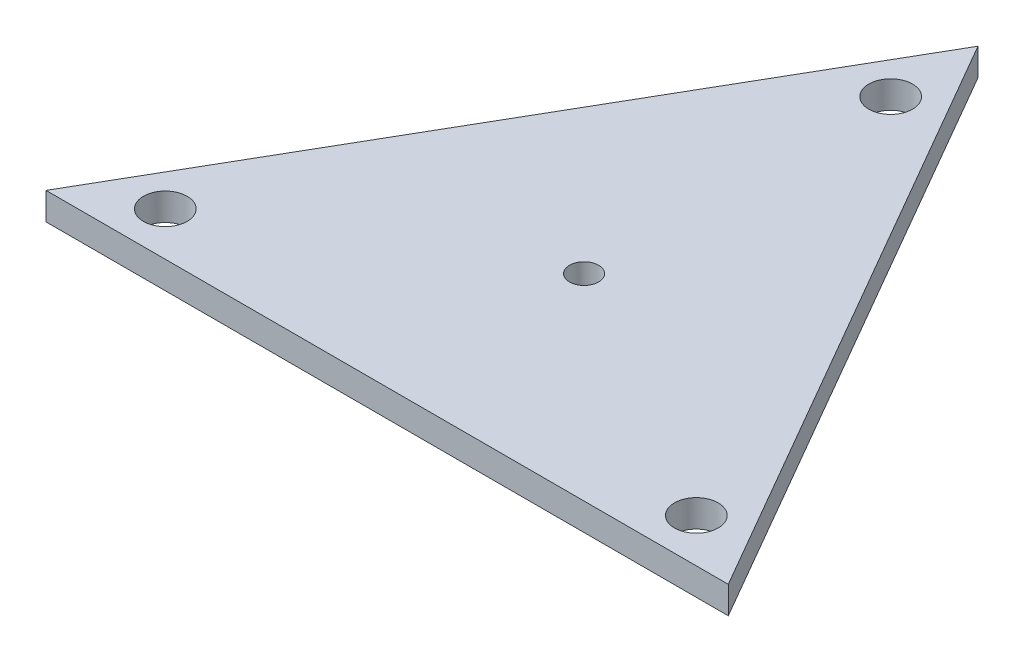
ISO-10303-21;
HEADER;
FILE_DESCRIPTION(('STEP AP214'),'2;1');
FILE_NAME('part.step','',(''),(''),'','','');
FILE_SCHEMA(('AUTOMOTIVE_DESIGN { 1 0 10303 214 1 1 1 1 }'));
ENDSEC;
DATA;
#1=APPLICATION_CONTEXT('core data for automotive mechanical design processes');
#2=APPLICATION_PROTOCOL_DEFINITION('international standard','automotive_design',2000,#1);
#3=PRODUCT_CONTEXT('',#1,'mechanical');
#4=PRODUCT('Part','Part','',(#3));
#5=PRODUCT_RELATED_PRODUCT_CATEGORY('part','',(#4));
#6=PRODUCT_DEFINITION_FORMATION('','',#4);
#7=PRODUCT_DEFINITION_CONTEXT('part definition',#1,'design');
#8=PRODUCT_DEFINITION('design','',#6,#7);
#9=PRODUCT_DEFINITION_SHAPE('','',#8);
#10=(LENGTH_UNIT() NAMED_UNIT(*) SI_UNIT(.MILLI.,.METRE.));
#11=(NAMED_UNIT(*) PLANE_ANGLE_UNIT() SI_UNIT($,.RADIAN.));
#12=(NAMED_UNIT(*) SI_UNIT($,.STERADIAN.) SOLID_ANGLE_UNIT());
#13=UNCERTAINTY_MEASURE_WITH_UNIT(LENGTH_MEASURE(1.E-05),#10,'distance_accuracy_value','');
#14=(GEOMETRIC_REPRESENTATION_CONTEXT(3) GLOBAL_UNCERTAINTY_ASSIGNED_CONTEXT((#13)) GLOBAL_UNIT_ASSIGNED_CONTEXT((#10,
#11,#12)) REPRESENTATION_CONTEXT('',''));
#15=CARTESIAN_POINT('',(0.,0.,0.));
#16=DIRECTION('',(0.,0.,1.));
#17=DIRECTION('',(1.,0.,0.));
#18=AXIS2_PLACEMENT_3D('',#15,#16,#17);
#19=CARTESIAN_POINT('',(-62.5,5.,0.));
#20=DIRECTION('',(0.866025403784439,0.,0.5));
#21=DIRECTION('',(0.5,0.,-0.866025403784439));
#22=AXIS2_PLACEMENT_3D('',#19,#20,#21);
#23=PLANE('',#22);
#24=DIRECTION('',(-0.5,0.,0.866025403784439));
#25=VECTOR('',#24,1.);
#26=CARTESIAN_POINT('',(-62.5,0.,0.));
#27=LINE('',#26,#25);
#28=CARTESIAN_POINT('',(0.,0.,-108.253175473055));
#29=VERTEX_POINT('',#28);
#30=CARTESIAN_POINT('',(-62.5,0.,0.));
#31=VERTEX_POINT('',#30);
#32=EDGE_CURVE('E95',#29,#31,#27,.T.);
#33=ORIENTED_EDGE('',*,*,#32,.T.);
#34=DIRECTION('',(0.,-1.,0.));
#35=VECTOR('',#34,1.);
#36=CARTESIAN_POINT('',(-62.5,5.,0.));
#37=LINE('',#36,#35);
#38=CARTESIAN_POINT('',(-62.5,5.,0.));
#39=VERTEX_POINT('',#38);
#40=EDGE_CURVE('E11',#39,#31,#37,.T.);
#41=ORIENTED_EDGE('',*,*,#40,.F.);
#42=DIRECTION('',(-0.5,0.,0.866025403784439));
#43=VECTOR('',#42,1.);
#44=CARTESIAN_POINT('',(-62.5,5.,0.));
#45=LINE('',#44,#43);
#46=CARTESIAN_POINT('',(0.,5.,-108.253175473055));
#47=VERTEX_POINT('',#46);
#48=EDGE_CURVE('E87',#47,#39,#45,.T.);
#49=ORIENTED_EDGE('',*,*,#48,.F.);
#50=DIRECTION('',(0.,-1.,0.));
#51=VECTOR('',#50,1.);
#52=CARTESIAN_POINT('',(0.,5.,-108.253175473055));
#53=LINE('',#52,#51);
#54=EDGE_CURVE('E96',#47,#29,#53,.T.);
#55=ORIENTED_EDGE('',*,*,#54,.T.);
#56=EDGE_LOOP('',(#33,#41,#49,#55));
#57=FACE_BOUND('',#56,.T.);
#58=ADVANCED_FACE('F45',(#57),#23,.F.);
#59=CARTESIAN_POINT('',(62.5,5.,0.));
#60=DIRECTION('',(0.,0.,-1.));
#61=DIRECTION('',(-1.,0.,0.));
#62=AXIS2_PLACEMENT_3D('',#59,#60,#61);
#63=PLANE('',#62);
#64=DIRECTION('',(1.,0.,0.));
#65=VECTOR('',#64,1.);
#66=CARTESIAN_POINT('',(62.5,0.,0.));
#67=LINE('',#66,#65);
#68=CARTESIAN_POINT('',(62.5,0.,0.));
#69=VERTEX_POINT('',#68);
#70=EDGE_CURVE('E74',#31,#69,#67,.T.);
#71=ORIENTED_EDGE('',*,*,#70,.T.);
#72=DIRECTION('',(0.,-1.,0.));
#73=VECTOR('',#72,1.);
#74=CARTESIAN_POINT('',(62.5,5.,0.));
#75=LINE('',#74,#73);
#76=CARTESIAN_POINT('',(62.5,5.,0.));
#77=VERTEX_POINT('',#76);
#78=EDGE_CURVE('E54',#77,#69,#75,.T.);
#79=ORIENTED_EDGE('',*,*,#78,.F.);
#80=DIRECTION('',(1.,0.,0.));
#81=VECTOR('',#80,1.);
#82=CARTESIAN_POINT('',(62.5,5.,0.));
#83=LINE('',#82,#81);
#84=EDGE_CURVE('E82',#39,#77,#83,.T.);
#85=ORIENTED_EDGE('',*,*,#84,.F.);
#86=ORIENTED_EDGE('',*,*,#40,.T.);
#87=EDGE_LOOP('',(#71,#79,#85,#86));
#88=FACE_BOUND('',#87,.T.);
#89=ADVANCED_FACE('F83',(#88),#63,.F.);
#90=CARTESIAN_POINT('',(0.,5.,-108.253175473055));
#91=DIRECTION('',(-0.866025403784439,0.,0.5));
#92=DIRECTION('',(0.5,0.,0.866025403784439));
#93=AXIS2_PLACEMENT_3D('',#90,#91,#92);
#94=PLANE('',#93);
#95=DIRECTION('',(-0.5,0.,-0.866025403784439));
#96=VECTOR('',#95,1.);
#97=CARTESIAN_POINT('',(0.,0.,-108.253175473055));
#98=LINE('',#97,#96);
#99=EDGE_CURVE('E79',#69,#29,#98,.T.);
#100=ORIENTED_EDGE('',*,*,#99,.T.);
#101=ORIENTED_EDGE('',*,*,#54,.F.);
#102=DIRECTION('',(-0.5,0.,-0.866025403784439));
#103=VECTOR('',#102,1.);
#104=CARTESIAN_POINT('',(0.,5.,-108.253175473055));
#105=LINE('',#104,#103);
#106=EDGE_CURVE('E62',#77,#47,#105,.T.);
#107=ORIENTED_EDGE('',*,*,#106,.F.);
#108=ORIENTED_EDGE('',*,*,#78,.T.);
#109=EDGE_LOOP('',(#100,#101,#107,#108));
#110=FACE_BOUND('',#109,.T.);
#111=ADVANCED_FACE('F113',(#110),#94,.F.);
#112=CARTESIAN_POINT('',(0.,5.,0.));
#113=DIRECTION('',(0.,-1.,0.));
#114=DIRECTION('',(0.,0.,-1.));
#115=AXIS2_PLACEMENT_3D('',#112,#113,#114);
#116=PLANE('',#115);
#117=CARTESIAN_POINT('',(-48.643593539449,5.,-8.));
#118=DIRECTION('',(0.,-1.,0.));
#119=DIRECTION('',(0.,0.,-1.));
#120=AXIS2_PLACEMENT_3D('',#117,#118,#119);
#121=CIRCLE('',#120,4.00000000000001);
#122=CARTESIAN_POINT('',(-48.643593539449,5.,-12.));
#123=VERTEX_POINT('',#122);
#124=EDGE_CURVE('E99',#123,#123,#121,.T.);
#125=ORIENTED_EDGE('',*,*,#124,.T.);
#126=EDGE_LOOP('',(#125));
#127=FACE_BOUND('',#126,.T.);
#128=CARTESIAN_POINT('',(0.,5.,-36.0843918243516));
#129=DIRECTION('',(0.,-1.,0.));
#130=DIRECTION('',(0.,0.,-1.));
#131=AXIS2_PLACEMENT_3D('',#128,#129,#130);
#132=CIRCLE('',#131,2.66520989540386);
#133=CARTESIAN_POINT('',(0.,5.,-38.7496017197555));
#134=VERTEX_POINT('',#133);
#135=EDGE_CURVE('E105',#134,#134,#132,.T.);
#136=ORIENTED_EDGE('',*,*,#135,.T.);
#137=EDGE_LOOP('',(#136));
#138=FACE_BOUND('',#137,.T.);
#139=CARTESIAN_POINT('',(0.,5.,-92.2531754730548));
#140=DIRECTION('',(0.,-1.,0.));
#141=DIRECTION('',(0.,0.,-1.));
#142=AXIS2_PLACEMENT_3D('',#139,#140,#141);
#143=CIRCLE('',#142,4.00000000000001);
#144=CARTESIAN_POINT('',(0.,5.,-96.2531754730548));
#145=VERTEX_POINT('',#144);
#146=EDGE_CURVE('E199',#145,#145,#143,.T.);
#147=ORIENTED_EDGE('',*,*,#146,.T.);
#148=EDGE_LOOP('',(#147));
#149=FACE_BOUND('',#148,.T.);
#150=CARTESIAN_POINT('',(48.643593539449,5.,-8.));
#151=DIRECTION('',(0.,-1.,0.));
#152=DIRECTION('',(0.,0.,-1.));
#153=AXIS2_PLACEMENT_3D('',#150,#151,#152);
#154=CIRCLE('',#153,4.00000000000001);
#155=CARTESIAN_POINT('',(48.643593539449,5.,-12.));
#156=VERTEX_POINT('',#155);
#157=EDGE_CURVE('E202',#156,#156,#154,.T.);
#158=ORIENTED_EDGE('',*,*,#157,.T.);
#159=EDGE_LOOP('',(#158));
#160=FACE_BOUND('',#159,.T.);
#161=ORIENTED_EDGE('',*,*,#48,.T.);
#162=ORIENTED_EDGE('',*,*,#84,.T.);
#163=ORIENTED_EDGE('',*,*,#106,.T.);
#164=EDGE_LOOP('',(#161,#162,#163));
#165=FACE_BOUND('',#164,.T.);
#166=ADVANCED_FACE('F90',(#127,#138,#149,#160,#165),#116,.F.);
#167=CARTESIAN_POINT('',(0.,0.,0.));
#168=DIRECTION('',(0.,-1.,0.));
#169=DIRECTION('',(0.,0.,-1.));
#170=AXIS2_PLACEMENT_3D('',#167,#168,#169);
#171=PLANE('',#170);
#172=CARTESIAN_POINT('',(-48.643593539449,0.,-8.));
#173=DIRECTION('',(0.,1.,0.));
#174=DIRECTION('',(0.,0.,1.));
#175=AXIS2_PLACEMENT_3D('',#172,#173,#174);
#176=CIRCLE('',#175,4.00000000000001);
#177=CARTESIAN_POINT('',(-48.643593539449,0.,-3.99999999999999));
#178=VERTEX_POINT('',#177);
#179=EDGE_CURVE('E190',#178,#178,#176,.T.);
#180=ORIENTED_EDGE('',*,*,#179,.T.);
#181=EDGE_LOOP('',(#180));
#182=FACE_BOUND('',#181,.T.);
#183=CARTESIAN_POINT('',(0.,0.,-36.0843918243516));
#184=DIRECTION('',(0.,1.,0.));
#185=DIRECTION('',(0.,0.,1.));
#186=AXIS2_PLACEMENT_3D('',#183,#184,#185);
#187=CIRCLE('',#186,2.66520989540386);
#188=CARTESIAN_POINT('',(0.,0.,-33.4191819289478));
#189=VERTEX_POINT('',#188);
#190=EDGE_CURVE('E218',#189,#189,#187,.T.);
#191=ORIENTED_EDGE('',*,*,#190,.T.);
#192=EDGE_LOOP('',(#191));
#193=FACE_BOUND('',#192,.T.);
#194=CARTESIAN_POINT('',(0.,0.,-92.2531754730548));
#195=DIRECTION('',(0.,1.,0.));
#196=DIRECTION('',(0.,0.,1.));
#197=AXIS2_PLACEMENT_3D('',#194,#195,#196);
#198=CIRCLE('',#197,4.00000000000001);
#199=CARTESIAN_POINT('',(0.,0.,-88.2531754730548));
#200=VERTEX_POINT('',#199);
#201=EDGE_CURVE('E212',#200,#200,#198,.T.);
#202=ORIENTED_EDGE('',*,*,#201,.T.);
#203=EDGE_LOOP('',(#202));
#204=FACE_BOUND('',#203,.T.);
#205=CARTESIAN_POINT('',(48.643593539449,0.,-8.));
#206=DIRECTION('',(0.,1.,0.));
#207=DIRECTION('',(0.,0.,1.));
#208=AXIS2_PLACEMENT_3D('',#205,#206,#207);
#209=CIRCLE('',#208,4.00000000000001);
#210=CARTESIAN_POINT('',(48.643593539449,0.,-3.99999999999999));
#211=VERTEX_POINT('',#210);
#212=EDGE_CURVE('E209',#211,#211,#209,.T.);
#213=ORIENTED_EDGE('',*,*,#212,.T.);
#214=EDGE_LOOP('',(#213));
#215=FACE_BOUND('',#214,.T.);
#216=ORIENTED_EDGE('',*,*,#32,.F.);
#217=ORIENTED_EDGE('',*,*,#99,.F.);
#218=ORIENTED_EDGE('',*,*,#70,.F.);
#219=EDGE_LOOP('',(#216,#217,#218));
#220=FACE_BOUND('',#219,.T.);
#221=ADVANCED_FACE('F114',(#182,#193,#204,#215,#220),#171,.T.);
#222=CARTESIAN_POINT('',(48.643593539449,0.,-8.));
#223=DIRECTION('',(0.,1.,0.));
#224=DIRECTION('',(0.,0.,1.));
#225=AXIS2_PLACEMENT_3D('',#222,#223,#224);
#226=CYLINDRICAL_SURFACE('',#225,4.00000000000001);
#227=ORIENTED_EDGE('',*,*,#212,.F.);
#228=EDGE_LOOP('',(#227));
#229=FACE_BOUND('',#228,.T.);
#230=ORIENTED_EDGE('',*,*,#157,.F.);
#231=EDGE_LOOP('',(#230));
#232=FACE_BOUND('',#231,.T.);
#233=ADVANCED_FACE('F116',(#229,#232),#226,.F.);
#234=CARTESIAN_POINT('',(0.,0.,-92.2531754730548));
#235=DIRECTION('',(0.,1.,0.));
#236=DIRECTION('',(0.,0.,1.));
#237=AXIS2_PLACEMENT_3D('',#234,#235,#236);
#238=CYLINDRICAL_SURFACE('',#237,4.00000000000001);
#239=ORIENTED_EDGE('',*,*,#201,.F.);
#240=EDGE_LOOP('',(#239));
#241=FACE_BOUND('',#240,.T.);
#242=ORIENTED_EDGE('',*,*,#146,.F.);
#243=EDGE_LOOP('',(#242));
#244=FACE_BOUND('',#243,.T.);
#245=ADVANCED_FACE('F123',(#241,#244),#238,.F.);
#246=CARTESIAN_POINT('',(0.,0.,-36.0843918243516));
#247=DIRECTION('',(0.,1.,0.));
#248=DIRECTION('',(0.,0.,1.));
#249=AXIS2_PLACEMENT_3D('',#246,#247,#248);
#250=CYLINDRICAL_SURFACE('',#249,2.66520989540386);
#251=ORIENTED_EDGE('',*,*,#190,.F.);
#252=EDGE_LOOP('',(#251));
#253=FACE_BOUND('',#252,.T.);
#254=ORIENTED_EDGE('',*,*,#135,.F.);
#255=EDGE_LOOP('',(#254));
#256=FACE_BOUND('',#255,.T.);
#257=ADVANCED_FACE('F165',(#253,#256),#250,.F.);
#258=CARTESIAN_POINT('',(-48.643593539449,0.,-8.));
#259=DIRECTION('',(0.,1.,0.));
#260=DIRECTION('',(0.,0.,1.));
#261=AXIS2_PLACEMENT_3D('',#258,#259,#260);
#262=CYLINDRICAL_SURFACE('',#261,4.00000000000001);
#263=ORIENTED_EDGE('',*,*,#179,.F.);
#264=EDGE_LOOP('',(#263));
#265=FACE_BOUND('',#264,.T.);
#266=ORIENTED_EDGE('',*,*,#124,.F.);
#267=EDGE_LOOP('',(#266));
#268=FACE_BOUND('',#267,.T.);
#269=ADVANCED_FACE('F175',(#265,#268),#262,.F.);
#270=CLOSED_SHELL('',(#58,#89,#111,#166,#221,#233,#245,#257,#269));
#271=MANIFOLD_SOLID_BREP('B2',#270);
#272=ADVANCED_BREP_SHAPE_REPRESENTATION('',(#18,#271),#14);
#273=SHAPE_DEFINITION_REPRESENTATION(#9,#272);
ENDSEC;
END-ISO-10303-21;
